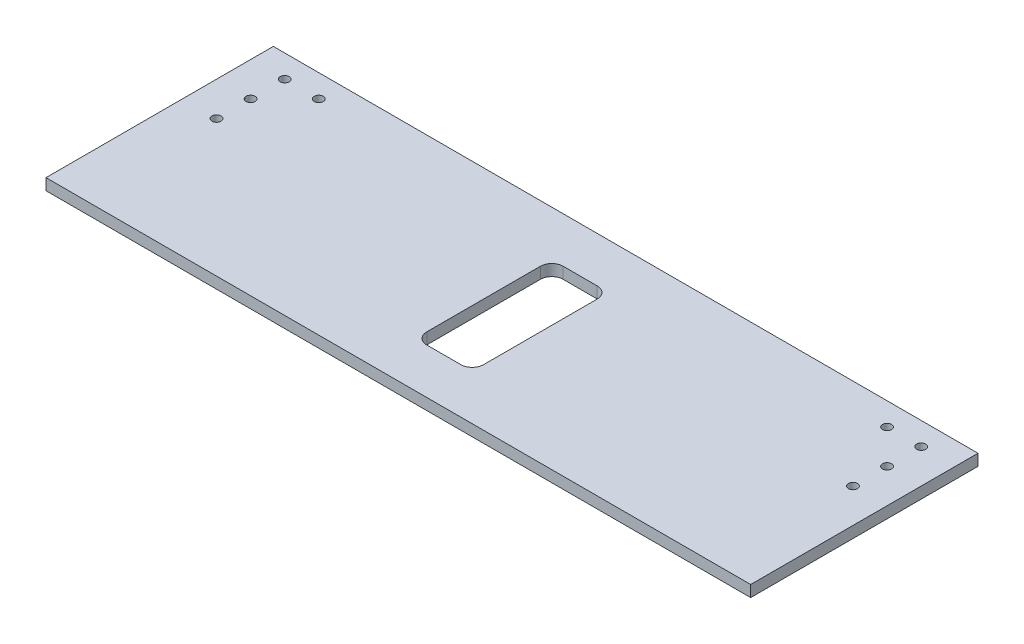
ISO-10303-21;
HEADER;
FILE_DESCRIPTION(('STEP AP214'),'2;1');
FILE_NAME('part.step','',(''),(''),'','','');
FILE_SCHEMA(('AUTOMOTIVE_DESIGN { 1 0 10303 214 1 1 1 1 }'));
ENDSEC;
DATA;
#1=APPLICATION_CONTEXT('core data for automotive mechanical design processes');
#2=APPLICATION_PROTOCOL_DEFINITION('international standard','automotive_design',2000,#1);
#3=PRODUCT_CONTEXT('',#1,'mechanical');
#4=PRODUCT('Part','Part','',(#3));
#5=PRODUCT_RELATED_PRODUCT_CATEGORY('part','',(#4));
#6=PRODUCT_DEFINITION_FORMATION('','',#4);
#7=PRODUCT_DEFINITION_CONTEXT('part definition',#1,'design');
#8=PRODUCT_DEFINITION('design','',#6,#7);
#9=PRODUCT_DEFINITION_SHAPE('','',#8);
#10=(LENGTH_UNIT() NAMED_UNIT(*) SI_UNIT(.MILLI.,.METRE.));
#11=(NAMED_UNIT(*) PLANE_ANGLE_UNIT() SI_UNIT($,.RADIAN.));
#12=(NAMED_UNIT(*) SI_UNIT($,.STERADIAN.) SOLID_ANGLE_UNIT());
#13=UNCERTAINTY_MEASURE_WITH_UNIT(LENGTH_MEASURE(1.E-05),#10,'distance_accuracy_value','');
#14=(GEOMETRIC_REPRESENTATION_CONTEXT(3) GLOBAL_UNCERTAINTY_ASSIGNED_CONTEXT((#13)) GLOBAL_UNIT_ASSIGNED_CONTEXT((#10,
#11,#12)) REPRESENTATION_CONTEXT('',''));
#15=CARTESIAN_POINT('',(0.,0.,0.));
#16=DIRECTION('',(0.,0.,1.));
#17=DIRECTION('',(1.,0.,0.));
#18=AXIS2_PLACEMENT_3D('',#15,#16,#17);
#19=CARTESIAN_POINT('',(-155.,5.,0.));
#20=DIRECTION('',(1.,0.,0.));
#21=DIRECTION('',(0.,0.,-1.));
#22=AXIS2_PLACEMENT_3D('',#19,#20,#21);
#23=PLANE('',#22);
#24=DIRECTION('',(0.,0.,1.));
#25=VECTOR('',#24,1.);
#26=CARTESIAN_POINT('',(-155.,5.,0.));
#27=LINE('',#26,#25);
#28=CARTESIAN_POINT('',(-155.,5.,-50.));
#29=VERTEX_POINT('',#28);
#30=CARTESIAN_POINT('',(-155.,5.,50.));
#31=VERTEX_POINT('',#30);
#32=EDGE_CURVE('E147',#29,#31,#27,.T.);
#33=ORIENTED_EDGE('',*,*,#32,.F.);
#34=DIRECTION('',(0.,1.,0.));
#35=VECTOR('',#34,1.);
#36=CARTESIAN_POINT('',(-155.,0.,-50.));
#37=LINE('',#36,#35);
#38=CARTESIAN_POINT('',(-155.,0.,-50.));
#39=VERTEX_POINT('',#38);
#40=EDGE_CURVE('E133',#39,#29,#37,.T.);
#41=ORIENTED_EDGE('',*,*,#40,.F.);
#42=DIRECTION('',(0.,0.,1.));
#43=VECTOR('',#42,1.);
#44=CARTESIAN_POINT('',(-155.,0.,0.));
#45=LINE('',#44,#43);
#46=CARTESIAN_POINT('',(-155.,0.,50.));
#47=VERTEX_POINT('',#46);
#48=EDGE_CURVE('E145',#39,#47,#45,.T.);
#49=ORIENTED_EDGE('',*,*,#48,.T.);
#50=DIRECTION('',(0.,-1.,0.));
#51=VECTOR('',#50,1.);
#52=CARTESIAN_POINT('',(-155.,5.,50.));
#53=LINE('',#52,#51);
#54=EDGE_CURVE('E168',#31,#47,#53,.T.);
#55=ORIENTED_EDGE('',*,*,#54,.F.);
#56=EDGE_LOOP('',(#33,#41,#49,#55));
#57=FACE_BOUND('',#56,.T.);
#58=ADVANCED_FACE('F40',(#57),#23,.F.);
#59=CARTESIAN_POINT('',(0.,5.,50.));
#60=DIRECTION('',(0.,0.,-1.));
#61=DIRECTION('',(-1.,0.,0.));
#62=AXIS2_PLACEMENT_3D('',#59,#60,#61);
#63=PLANE('',#62);
#64=DIRECTION('',(1.,0.,0.));
#65=VECTOR('',#64,1.);
#66=CARTESIAN_POINT('',(0.,0.,50.));
#67=LINE('',#66,#65);
#68=CARTESIAN_POINT('',(155.,0.,50.));
#69=VERTEX_POINT('',#68);
#70=EDGE_CURVE('E153',#47,#69,#67,.T.);
#71=ORIENTED_EDGE('',*,*,#70,.T.);
#72=DIRECTION('',(0.,-1.,0.));
#73=VECTOR('',#72,1.);
#74=CARTESIAN_POINT('',(155.,5.,50.));
#75=LINE('',#74,#73);
#76=CARTESIAN_POINT('',(155.,5.,50.));
#77=VERTEX_POINT('',#76);
#78=EDGE_CURVE('E165',#77,#69,#75,.T.);
#79=ORIENTED_EDGE('',*,*,#78,.F.);
#80=DIRECTION('',(1.,0.,0.));
#81=VECTOR('',#80,1.);
#82=CARTESIAN_POINT('',(0.,5.,50.));
#83=LINE('',#82,#81);
#84=EDGE_CURVE('E237',#31,#77,#83,.T.);
#85=ORIENTED_EDGE('',*,*,#84,.F.);
#86=ORIENTED_EDGE('',*,*,#54,.T.);
#87=EDGE_LOOP('',(#71,#79,#85,#86));
#88=FACE_BOUND('',#87,.T.);
#89=ADVANCED_FACE('F322',(#88),#63,.F.);
#90=CARTESIAN_POINT('',(155.,5.,0.));
#91=DIRECTION('',(1.,0.,0.));
#92=DIRECTION('',(0.,0.,-1.));
#93=AXIS2_PLACEMENT_3D('',#90,#91,#92);
#94=PLANE('',#93);
#95=DIRECTION('',(0.,1.,0.));
#96=VECTOR('',#95,1.);
#97=CARTESIAN_POINT('',(155.,0.,-50.));
#98=LINE('',#97,#96);
#99=CARTESIAN_POINT('',(155.,0.,-50.));
#100=VERTEX_POINT('',#99);
#101=CARTESIAN_POINT('',(155.,5.,-50.));
#102=VERTEX_POINT('',#101);
#103=EDGE_CURVE('E136',#100,#102,#98,.T.);
#104=ORIENTED_EDGE('',*,*,#103,.T.);
#105=DIRECTION('',(0.,0.,1.));
#106=VECTOR('',#105,1.);
#107=CARTESIAN_POINT('',(155.,5.,0.));
#108=LINE('',#107,#106);
#109=EDGE_CURVE('E161',#102,#77,#108,.T.);
#110=ORIENTED_EDGE('',*,*,#109,.T.);
#111=ORIENTED_EDGE('',*,*,#78,.T.);
#112=DIRECTION('',(0.,0.,1.));
#113=VECTOR('',#112,1.);
#114=CARTESIAN_POINT('',(155.,0.,0.));
#115=LINE('',#114,#113);
#116=EDGE_CURVE('E156',#100,#69,#115,.T.);
#117=ORIENTED_EDGE('',*,*,#116,.F.);
#118=EDGE_LOOP('',(#104,#110,#111,#117));
#119=FACE_BOUND('',#118,.T.);
#120=ADVANCED_FACE('F244',(#119),#94,.T.);
#121=CARTESIAN_POINT('',(0.,5.,0.));
#122=DIRECTION('',(0.,1.,0.));
#123=DIRECTION('',(0.,0.,1.));
#124=AXIS2_PLACEMENT_3D('',#121,#122,#123);
#125=PLANE('',#124);
#126=DIRECTION('',(1.,0.,0.));
#127=VECTOR('',#126,1.);
#128=CARTESIAN_POINT('',(-40.,5.,-50.));
#129=LINE('',#128,#127);
#130=EDGE_CURVE('E141',#29,#102,#129,.T.);
#131=ORIENTED_EDGE('',*,*,#130,.F.);
#132=ORIENTED_EDGE('',*,*,#32,.T.);
#133=ORIENTED_EDGE('',*,*,#84,.T.);
#134=ORIENTED_EDGE('',*,*,#109,.F.);
#135=EDGE_LOOP('',(#131,#132,#133,#134));
#136=FACE_BOUND('',#135,.T.);
#137=CARTESIAN_POINT('',(140.,5.,-40.));
#138=DIRECTION('',(0.,1.,0.));
#139=DIRECTION('',(0.,0.,-1.));
#140=AXIS2_PLACEMENT_3D('',#137,#138,#139);
#141=CIRCLE('',#140,2.);
#142=CARTESIAN_POINT('',(140.,5.,-42.));
#143=VERTEX_POINT('',#142);
#144=EDGE_CURVE('E140',#143,#143,#141,.T.);
#145=ORIENTED_EDGE('',*,*,#144,.F.);
#146=EDGE_LOOP('',(#145));
#147=FACE_BOUND('',#146,.T.);
#148=CARTESIAN_POINT('',(125.,5.,-40.));
#149=DIRECTION('',(0.,1.,0.));
#150=DIRECTION('',(0.,0.,-1.));
#151=AXIS2_PLACEMENT_3D('',#148,#149,#150);
#152=CIRCLE('',#151,2.);
#153=CARTESIAN_POINT('',(125.,5.,-42.));
#154=VERTEX_POINT('',#153);
#155=EDGE_CURVE('E287',#154,#154,#152,.T.);
#156=ORIENTED_EDGE('',*,*,#155,.F.);
#157=EDGE_LOOP('',(#156));
#158=FACE_BOUND('',#157,.T.);
#159=CARTESIAN_POINT('',(140.,5.,-25.));
#160=DIRECTION('',(0.,1.,0.));
#161=DIRECTION('',(0.,0.,-1.));
#162=AXIS2_PLACEMENT_3D('',#159,#160,#161);
#163=CIRCLE('',#162,2.);
#164=CARTESIAN_POINT('',(140.,5.,-27.));
#165=VERTEX_POINT('',#164);
#166=EDGE_CURVE('E281',#165,#165,#163,.T.);
#167=ORIENTED_EDGE('',*,*,#166,.F.);
#168=EDGE_LOOP('',(#167));
#169=FACE_BOUND('',#168,.T.);
#170=CARTESIAN_POINT('',(140.,5.,-10.));
#171=DIRECTION('',(0.,1.,0.));
#172=DIRECTION('',(0.,0.,-1.));
#173=AXIS2_PLACEMENT_3D('',#170,#171,#172);
#174=CIRCLE('',#173,2.);
#175=CARTESIAN_POINT('',(140.,5.,-12.));
#176=VERTEX_POINT('',#175);
#177=EDGE_CURVE('E275',#176,#176,#174,.T.);
#178=ORIENTED_EDGE('',*,*,#177,.F.);
#179=EDGE_LOOP('',(#178));
#180=FACE_BOUND('',#179,.T.);
#181=CARTESIAN_POINT('',(-140.,5.,-10.));
#182=DIRECTION('',(0.,1.,0.));
#183=DIRECTION('',(0.,0.,1.));
#184=AXIS2_PLACEMENT_3D('',#181,#182,#183);
#185=CIRCLE('',#184,2.);
#186=CARTESIAN_POINT('',(-140.,5.,-8.00000000000001));
#187=VERTEX_POINT('',#186);
#188=EDGE_CURVE('E269',#187,#187,#185,.T.);
#189=ORIENTED_EDGE('',*,*,#188,.F.);
#190=EDGE_LOOP('',(#189));
#191=FACE_BOUND('',#190,.T.);
#192=CARTESIAN_POINT('',(-140.,5.,-25.));
#193=DIRECTION('',(0.,1.,0.));
#194=DIRECTION('',(0.,0.,1.));
#195=AXIS2_PLACEMENT_3D('',#192,#193,#194);
#196=CIRCLE('',#195,2.);
#197=CARTESIAN_POINT('',(-140.,5.,-23.));
#198=VERTEX_POINT('',#197);
#199=EDGE_CURVE('E263',#198,#198,#196,.T.);
#200=ORIENTED_EDGE('',*,*,#199,.F.);
#201=EDGE_LOOP('',(#200));
#202=FACE_BOUND('',#201,.T.);
#203=CARTESIAN_POINT('',(-125.,5.,-40.));
#204=DIRECTION('',(0.,1.,0.));
#205=DIRECTION('',(0.,0.,1.));
#206=AXIS2_PLACEMENT_3D('',#203,#204,#205);
#207=CIRCLE('',#206,2.);
#208=CARTESIAN_POINT('',(-125.,5.,-38.));
#209=VERTEX_POINT('',#208);
#210=EDGE_CURVE('E257',#209,#209,#207,.T.);
#211=ORIENTED_EDGE('',*,*,#210,.F.);
#212=EDGE_LOOP('',(#211));
#213=FACE_BOUND('',#212,.T.);
#214=CARTESIAN_POINT('',(-140.,5.,-40.));
#215=DIRECTION('',(0.,1.,0.));
#216=DIRECTION('',(0.,0.,1.));
#217=AXIS2_PLACEMENT_3D('',#214,#215,#216);
#218=CIRCLE('',#217,2.);
#219=CARTESIAN_POINT('',(-140.,5.,-38.));
#220=VERTEX_POINT('',#219);
#221=EDGE_CURVE('E251',#220,#220,#218,.T.);
#222=ORIENTED_EDGE('',*,*,#221,.F.);
#223=EDGE_LOOP('',(#222));
#224=FACE_BOUND('',#223,.T.);
#225=DIRECTION('',(0.,0.,-1.));
#226=VECTOR('',#225,1.);
#227=CARTESIAN_POINT('',(12.5,5.,30.));
#228=LINE('',#227,#226);
#229=CARTESIAN_POINT('',(12.5,5.,25.));
#230=VERTEX_POINT('',#229);
#231=CARTESIAN_POINT('',(12.5,5.,-25.));
#232=VERTEX_POINT('',#231);
#233=EDGE_CURVE('E216',#230,#232,#228,.T.);
#234=ORIENTED_EDGE('',*,*,#233,.F.);
#235=CARTESIAN_POINT('',(7.5,5.,25.));
#236=DIRECTION('',(0.,1.,0.));
#237=DIRECTION('',(0.,0.,1.));
#238=AXIS2_PLACEMENT_3D('',#235,#236,#237);
#239=CIRCLE('',#238,5.);
#240=CARTESIAN_POINT('',(7.5,5.,30.));
#241=VERTEX_POINT('',#240);
#242=EDGE_CURVE('E197',#230,#241,#239,.F.);
#243=ORIENTED_EDGE('',*,*,#242,.T.);
#244=DIRECTION('',(1.,0.,0.));
#245=VECTOR('',#244,1.);
#246=CARTESIAN_POINT('',(-12.5,5.,30.));
#247=LINE('',#246,#245);
#248=CARTESIAN_POINT('',(-7.5,5.,30.));
#249=VERTEX_POINT('',#248);
#250=EDGE_CURVE('E234',#249,#241,#247,.T.);
#251=ORIENTED_EDGE('',*,*,#250,.F.);
#252=CARTESIAN_POINT('',(-7.5,5.,25.));
#253=DIRECTION('',(0.,1.,0.));
#254=DIRECTION('',(0.,0.,1.));
#255=AXIS2_PLACEMENT_3D('',#252,#253,#254);
#256=CIRCLE('',#255,5.);
#257=CARTESIAN_POINT('',(-12.5,5.,25.));
#258=VERTEX_POINT('',#257);
#259=EDGE_CURVE('E189',#249,#258,#256,.F.);
#260=ORIENTED_EDGE('',*,*,#259,.T.);
#261=DIRECTION('',(0.,0.,1.));
#262=VECTOR('',#261,1.);
#263=CARTESIAN_POINT('',(-12.5,5.,30.));
#264=LINE('',#263,#262);
#265=CARTESIAN_POINT('',(-12.5,5.,-25.));
#266=VERTEX_POINT('',#265);
#267=EDGE_CURVE('E207',#266,#258,#264,.T.);
#268=ORIENTED_EDGE('',*,*,#267,.F.);
#269=CARTESIAN_POINT('',(-7.5,5.,-25.));
#270=DIRECTION('',(0.,1.,0.));
#271=DIRECTION('',(0.,0.,1.));
#272=AXIS2_PLACEMENT_3D('',#269,#270,#271);
#273=CIRCLE('',#272,5.);
#274=CARTESIAN_POINT('',(-7.5,5.,-30.));
#275=VERTEX_POINT('',#274);
#276=EDGE_CURVE('E48',#266,#275,#273,.F.);
#277=ORIENTED_EDGE('',*,*,#276,.T.);
#278=DIRECTION('',(-1.,0.,0.));
#279=VECTOR('',#278,1.);
#280=CARTESIAN_POINT('',(-12.5,5.,-30.));
#281=LINE('',#280,#279);
#282=CARTESIAN_POINT('',(7.5,5.,-30.));
#283=VERTEX_POINT('',#282);
#284=EDGE_CURVE('E205',#283,#275,#281,.T.);
#285=ORIENTED_EDGE('',*,*,#284,.F.);
#286=CARTESIAN_POINT('',(7.5,5.,-25.));
#287=DIRECTION('',(0.,1.,0.));
#288=DIRECTION('',(0.,0.,1.));
#289=AXIS2_PLACEMENT_3D('',#286,#287,#288);
#290=CIRCLE('',#289,5.);
#291=EDGE_CURVE('E193',#283,#232,#290,.F.);
#292=ORIENTED_EDGE('',*,*,#291,.T.);
#293=EDGE_LOOP('',(#234,#243,#251,#260,#268,#277,#285,#292));
#294=FACE_BOUND('',#293,.T.);
#295=ADVANCED_FACE('F204',(#136,#147,#158,#169,#180,#191,#202,#213,#224,#294),#125,.T.);
#296=CARTESIAN_POINT('',(0.,0.,0.));
#297=DIRECTION('',(0.,1.,0.));
#298=DIRECTION('',(0.,0.,1.));
#299=AXIS2_PLACEMENT_3D('',#296,#297,#298);
#300=PLANE('',#299);
#301=ORIENTED_EDGE('',*,*,#48,.F.);
#302=DIRECTION('',(1.,0.,0.));
#303=VECTOR('',#302,1.);
#304=CARTESIAN_POINT('',(-40.,0.,-50.));
#305=LINE('',#304,#303);
#306=EDGE_CURVE('E130',#39,#100,#305,.T.);
#307=ORIENTED_EDGE('',*,*,#306,.T.);
#308=ORIENTED_EDGE('',*,*,#116,.T.);
#309=ORIENTED_EDGE('',*,*,#70,.F.);
#310=EDGE_LOOP('',(#301,#307,#308,#309));
#311=FACE_BOUND('',#310,.T.);
#312=CARTESIAN_POINT('',(140.,0.,-40.));
#313=DIRECTION('',(0.,1.,0.));
#314=DIRECTION('',(0.,0.,-1.));
#315=AXIS2_PLACEMENT_3D('',#312,#313,#314);
#316=CIRCLE('',#315,2.);
#317=CARTESIAN_POINT('',(140.,0.,-42.));
#318=VERTEX_POINT('',#317);
#319=EDGE_CURVE('E290',#318,#318,#316,.T.);
#320=ORIENTED_EDGE('',*,*,#319,.T.);
#321=EDGE_LOOP('',(#320));
#322=FACE_BOUND('',#321,.T.);
#323=CARTESIAN_POINT('',(125.,0.,-40.));
#324=DIRECTION('',(0.,1.,0.));
#325=DIRECTION('',(0.,0.,-1.));
#326=AXIS2_PLACEMENT_3D('',#323,#324,#325);
#327=CIRCLE('',#326,2.);
#328=CARTESIAN_POINT('',(125.,0.,-42.));
#329=VERTEX_POINT('',#328);
#330=EDGE_CURVE('E284',#329,#329,#327,.T.);
#331=ORIENTED_EDGE('',*,*,#330,.T.);
#332=EDGE_LOOP('',(#331));
#333=FACE_BOUND('',#332,.T.);
#334=CARTESIAN_POINT('',(140.,0.,-25.));
#335=DIRECTION('',(0.,1.,0.));
#336=DIRECTION('',(0.,0.,-1.));
#337=AXIS2_PLACEMENT_3D('',#334,#335,#336);
#338=CIRCLE('',#337,2.);
#339=CARTESIAN_POINT('',(140.,0.,-27.));
#340=VERTEX_POINT('',#339);
#341=EDGE_CURVE('E278',#340,#340,#338,.T.);
#342=ORIENTED_EDGE('',*,*,#341,.T.);
#343=EDGE_LOOP('',(#342));
#344=FACE_BOUND('',#343,.T.);
#345=CARTESIAN_POINT('',(140.,0.,-10.));
#346=DIRECTION('',(0.,1.,0.));
#347=DIRECTION('',(0.,0.,-1.));
#348=AXIS2_PLACEMENT_3D('',#345,#346,#347);
#349=CIRCLE('',#348,2.);
#350=CARTESIAN_POINT('',(140.,0.,-12.));
#351=VERTEX_POINT('',#350);
#352=EDGE_CURVE('E272',#351,#351,#349,.T.);
#353=ORIENTED_EDGE('',*,*,#352,.T.);
#354=EDGE_LOOP('',(#353));
#355=FACE_BOUND('',#354,.T.);
#356=CARTESIAN_POINT('',(-140.,0.,-10.));
#357=DIRECTION('',(0.,1.,0.));
#358=DIRECTION('',(0.,0.,1.));
#359=AXIS2_PLACEMENT_3D('',#356,#357,#358);
#360=CIRCLE('',#359,2.);
#361=CARTESIAN_POINT('',(-140.,0.,-8.00000000000001));
#362=VERTEX_POINT('',#361);
#363=EDGE_CURVE('E266',#362,#362,#360,.T.);
#364=ORIENTED_EDGE('',*,*,#363,.T.);
#365=EDGE_LOOP('',(#364));
#366=FACE_BOUND('',#365,.T.);
#367=CARTESIAN_POINT('',(-140.,0.,-25.));
#368=DIRECTION('',(0.,1.,0.));
#369=DIRECTION('',(0.,0.,1.));
#370=AXIS2_PLACEMENT_3D('',#367,#368,#369);
#371=CIRCLE('',#370,2.);
#372=CARTESIAN_POINT('',(-140.,0.,-23.));
#373=VERTEX_POINT('',#372);
#374=EDGE_CURVE('E260',#373,#373,#371,.T.);
#375=ORIENTED_EDGE('',*,*,#374,.T.);
#376=EDGE_LOOP('',(#375));
#377=FACE_BOUND('',#376,.T.);
#378=CARTESIAN_POINT('',(-125.,0.,-40.));
#379=DIRECTION('',(0.,1.,0.));
#380=DIRECTION('',(0.,0.,1.));
#381=AXIS2_PLACEMENT_3D('',#378,#379,#380);
#382=CIRCLE('',#381,2.);
#383=CARTESIAN_POINT('',(-125.,0.,-38.));
#384=VERTEX_POINT('',#383);
#385=EDGE_CURVE('E254',#384,#384,#382,.T.);
#386=ORIENTED_EDGE('',*,*,#385,.T.);
#387=EDGE_LOOP('',(#386));
#388=FACE_BOUND('',#387,.T.);
#389=CARTESIAN_POINT('',(-140.,0.,-40.));
#390=DIRECTION('',(0.,1.,0.));
#391=DIRECTION('',(0.,0.,1.));
#392=AXIS2_PLACEMENT_3D('',#389,#390,#391);
#393=CIRCLE('',#392,2.);
#394=CARTESIAN_POINT('',(-140.,0.,-38.));
#395=VERTEX_POINT('',#394);
#396=EDGE_CURVE('E231',#395,#395,#393,.T.);
#397=ORIENTED_EDGE('',*,*,#396,.T.);
#398=EDGE_LOOP('',(#397));
#399=FACE_BOUND('',#398,.T.);
#400=DIRECTION('',(0.,0.,1.));
#401=VECTOR('',#400,1.);
#402=CARTESIAN_POINT('',(-12.5,0.,30.));
#403=LINE('',#402,#401);
#404=CARTESIAN_POINT('',(-12.5,0.,-25.));
#405=VERTEX_POINT('',#404);
#406=CARTESIAN_POINT('',(-12.5,0.,25.));
#407=VERTEX_POINT('',#406);
#408=EDGE_CURVE('E158',#405,#407,#403,.T.);
#409=ORIENTED_EDGE('',*,*,#408,.T.);
#410=CARTESIAN_POINT('',(-7.5,0.,25.));
#411=DIRECTION('',(0.,1.,0.));
#412=DIRECTION('',(0.,0.,1.));
#413=AXIS2_PLACEMENT_3D('',#410,#411,#412);
#414=CIRCLE('',#413,5.);
#415=CARTESIAN_POINT('',(-7.5,0.,30.));
#416=VERTEX_POINT('',#415);
#417=EDGE_CURVE('E191',#407,#416,#414,.T.);
#418=ORIENTED_EDGE('',*,*,#417,.T.);
#419=DIRECTION('',(1.,0.,0.));
#420=VECTOR('',#419,1.);
#421=CARTESIAN_POINT('',(-12.5,0.,30.));
#422=LINE('',#421,#420);
#423=CARTESIAN_POINT('',(7.5,0.,30.));
#424=VERTEX_POINT('',#423);
#425=EDGE_CURVE('E154',#416,#424,#422,.T.);
#426=ORIENTED_EDGE('',*,*,#425,.T.);
#427=CARTESIAN_POINT('',(7.5,0.,25.));
#428=DIRECTION('',(0.,1.,0.));
#429=DIRECTION('',(0.,0.,1.));
#430=AXIS2_PLACEMENT_3D('',#427,#428,#429);
#431=CIRCLE('',#430,5.);
#432=CARTESIAN_POINT('',(12.5,0.,25.));
#433=VERTEX_POINT('',#432);
#434=EDGE_CURVE('E62',#424,#433,#431,.T.);
#435=ORIENTED_EDGE('',*,*,#434,.T.);
#436=DIRECTION('',(0.,0.,-1.));
#437=VECTOR('',#436,1.);
#438=CARTESIAN_POINT('',(12.5,0.,30.));
#439=LINE('',#438,#437);
#440=CARTESIAN_POINT('',(12.5,0.,-25.));
#441=VERTEX_POINT('',#440);
#442=EDGE_CURVE('E227',#433,#441,#439,.T.);
#443=ORIENTED_EDGE('',*,*,#442,.T.);
#444=CARTESIAN_POINT('',(7.5,0.,-25.));
#445=DIRECTION('',(0.,1.,0.));
#446=DIRECTION('',(0.,0.,1.));
#447=AXIS2_PLACEMENT_3D('',#444,#445,#446);
#448=CIRCLE('',#447,5.);
#449=CARTESIAN_POINT('',(7.5,0.,-30.));
#450=VERTEX_POINT('',#449);
#451=EDGE_CURVE('E195',#441,#450,#448,.T.);
#452=ORIENTED_EDGE('',*,*,#451,.T.);
#453=DIRECTION('',(-1.,0.,0.));
#454=VECTOR('',#453,1.);
#455=CARTESIAN_POINT('',(-12.5,0.,-30.));
#456=LINE('',#455,#454);
#457=CARTESIAN_POINT('',(-7.5,0.,-30.));
#458=VERTEX_POINT('',#457);
#459=EDGE_CURVE('E222',#450,#458,#456,.T.);
#460=ORIENTED_EDGE('',*,*,#459,.T.);
#461=CARTESIAN_POINT('',(-7.5,0.,-25.));
#462=DIRECTION('',(0.,1.,0.));
#463=DIRECTION('',(0.,0.,1.));
#464=AXIS2_PLACEMENT_3D('',#461,#462,#463);
#465=CIRCLE('',#464,5.);
#466=EDGE_CURVE('E11',#458,#405,#465,.T.);
#467=ORIENTED_EDGE('',*,*,#466,.T.);
#468=EDGE_LOOP('',(#409,#418,#426,#435,#443,#452,#460,#467));
#469=FACE_BOUND('',#468,.T.);
#470=ADVANCED_FACE('F150',(#311,#322,#333,#344,#355,#366,#377,#388,#399,#469),#300,.F.);
#471=CARTESIAN_POINT('',(12.5,0.,30.));
#472=DIRECTION('',(1.,0.,0.));
#473=DIRECTION('',(0.,0.,-1.));
#474=AXIS2_PLACEMENT_3D('',#471,#472,#473);
#475=PLANE('',#474);
#476=ORIENTED_EDGE('',*,*,#233,.T.);
#477=DIRECTION('',(0.,1.,0.));
#478=VECTOR('',#477,1.);
#479=CARTESIAN_POINT('',(12.5,0.,-25.));
#480=LINE('',#479,#478);
#481=EDGE_CURVE('E55',#232,#441,#480,.F.);
#482=ORIENTED_EDGE('',*,*,#481,.T.);
#483=ORIENTED_EDGE('',*,*,#442,.F.);
#484=DIRECTION('',(0.,1.,0.));
#485=VECTOR('',#484,1.);
#486=CARTESIAN_POINT('',(12.5,5.,25.));
#487=LINE('',#486,#485);
#488=EDGE_CURVE('E185',#433,#230,#487,.T.);
#489=ORIENTED_EDGE('',*,*,#488,.T.);
#490=EDGE_LOOP('',(#476,#482,#483,#489));
#491=FACE_BOUND('',#490,.T.);
#492=ADVANCED_FACE('F298',(#491),#475,.F.);
#493=CARTESIAN_POINT('',(-12.5,0.,30.));
#494=DIRECTION('',(0.,0.,1.));
#495=DIRECTION('',(1.,0.,0.));
#496=AXIS2_PLACEMENT_3D('',#493,#494,#495);
#497=PLANE('',#496);
#498=ORIENTED_EDGE('',*,*,#425,.F.);
#499=DIRECTION('',(0.,1.,0.));
#500=VECTOR('',#499,1.);
#501=CARTESIAN_POINT('',(-7.5,5.,30.));
#502=LINE('',#501,#500);
#503=EDGE_CURVE('E172',#416,#249,#502,.T.);
#504=ORIENTED_EDGE('',*,*,#503,.T.);
#505=ORIENTED_EDGE('',*,*,#250,.T.);
#506=DIRECTION('',(0.,1.,0.));
#507=VECTOR('',#506,1.);
#508=CARTESIAN_POINT('',(7.5,0.,30.));
#509=LINE('',#508,#507);
#510=EDGE_CURVE('E170',#241,#424,#509,.F.);
#511=ORIENTED_EDGE('',*,*,#510,.T.);
#512=EDGE_LOOP('',(#498,#504,#505,#511));
#513=FACE_BOUND('',#512,.T.);
#514=ADVANCED_FACE('F305',(#513),#497,.F.);
#515=CARTESIAN_POINT('',(-12.5,0.,30.));
#516=DIRECTION('',(-1.,0.,0.));
#517=DIRECTION('',(0.,0.,1.));
#518=AXIS2_PLACEMENT_3D('',#515,#516,#517);
#519=PLANE('',#518);
#520=ORIENTED_EDGE('',*,*,#267,.T.);
#521=DIRECTION('',(0.,1.,0.));
#522=VECTOR('',#521,1.);
#523=CARTESIAN_POINT('',(-12.5,0.,25.));
#524=LINE('',#523,#522);
#525=EDGE_CURVE('E178',#258,#407,#524,.F.);
#526=ORIENTED_EDGE('',*,*,#525,.T.);
#527=ORIENTED_EDGE('',*,*,#408,.F.);
#528=DIRECTION('',(0.,1.,0.));
#529=VECTOR('',#528,1.);
#530=CARTESIAN_POINT('',(-12.5,5.,-25.));
#531=LINE('',#530,#529);
#532=EDGE_CURVE('E175',#405,#266,#531,.T.);
#533=ORIENTED_EDGE('',*,*,#532,.T.);
#534=EDGE_LOOP('',(#520,#526,#527,#533));
#535=FACE_BOUND('',#534,.T.);
#536=ADVANCED_FACE('F224',(#535),#519,.F.);
#537=CARTESIAN_POINT('',(-12.5,0.,-30.));
#538=DIRECTION('',(0.,0.,-1.));
#539=DIRECTION('',(-1.,0.,0.));
#540=AXIS2_PLACEMENT_3D('',#537,#538,#539);
#541=PLANE('',#540);
#542=ORIENTED_EDGE('',*,*,#459,.F.);
#543=DIRECTION('',(0.,1.,0.));
#544=VECTOR('',#543,1.);
#545=CARTESIAN_POINT('',(7.5,5.,-30.));
#546=LINE('',#545,#544);
#547=EDGE_CURVE('E182',#450,#283,#546,.T.);
#548=ORIENTED_EDGE('',*,*,#547,.T.);
#549=ORIENTED_EDGE('',*,*,#284,.T.);
#550=DIRECTION('',(0.,1.,0.));
#551=VECTOR('',#550,1.);
#552=CARTESIAN_POINT('',(-7.5,0.,-30.));
#553=LINE('',#552,#551);
#554=EDGE_CURVE('E180',#275,#458,#553,.F.);
#555=ORIENTED_EDGE('',*,*,#554,.T.);
#556=EDGE_LOOP('',(#542,#548,#549,#555));
#557=FACE_BOUND('',#556,.T.);
#558=ADVANCED_FACE('F213',(#557),#541,.F.);
#559=CARTESIAN_POINT('',(-140.,0.,-40.));
#560=DIRECTION('',(0.,1.,0.));
#561=DIRECTION('',(0.,0.,1.));
#562=AXIS2_PLACEMENT_3D('',#559,#560,#561);
#563=CYLINDRICAL_SURFACE('',#562,2.);
#564=ORIENTED_EDGE('',*,*,#396,.F.);
#565=EDGE_LOOP('',(#564));
#566=FACE_BOUND('',#565,.T.);
#567=ORIENTED_EDGE('',*,*,#221,.T.);
#568=EDGE_LOOP('',(#567));
#569=FACE_BOUND('',#568,.T.);
#570=ADVANCED_FACE('F339',(#566,#569),#563,.F.);
#571=CARTESIAN_POINT('',(-125.,0.,-40.));
#572=DIRECTION('',(0.,1.,0.));
#573=DIRECTION('',(0.,0.,1.));
#574=AXIS2_PLACEMENT_3D('',#571,#572,#573);
#575=CYLINDRICAL_SURFACE('',#574,2.);
#576=ORIENTED_EDGE('',*,*,#385,.F.);
#577=EDGE_LOOP('',(#576));
#578=FACE_BOUND('',#577,.T.);
#579=ORIENTED_EDGE('',*,*,#210,.T.);
#580=EDGE_LOOP('',(#579));
#581=FACE_BOUND('',#580,.T.);
#582=ADVANCED_FACE('F362',(#578,#581),#575,.F.);
#583=CARTESIAN_POINT('',(-140.,0.,-25.));
#584=DIRECTION('',(0.,1.,0.));
#585=DIRECTION('',(0.,0.,1.));
#586=AXIS2_PLACEMENT_3D('',#583,#584,#585);
#587=CYLINDRICAL_SURFACE('',#586,2.);
#588=ORIENTED_EDGE('',*,*,#374,.F.);
#589=EDGE_LOOP('',(#588));
#590=FACE_BOUND('',#589,.T.);
#591=ORIENTED_EDGE('',*,*,#199,.T.);
#592=EDGE_LOOP('',(#591));
#593=FACE_BOUND('',#592,.T.);
#594=ADVANCED_FACE('F358',(#590,#593),#587,.F.);
#595=CARTESIAN_POINT('',(-140.,0.,-10.));
#596=DIRECTION('',(0.,1.,0.));
#597=DIRECTION('',(0.,0.,1.));
#598=AXIS2_PLACEMENT_3D('',#595,#596,#597);
#599=CYLINDRICAL_SURFACE('',#598,2.);
#600=ORIENTED_EDGE('',*,*,#363,.F.);
#601=EDGE_LOOP('',(#600));
#602=FACE_BOUND('',#601,.T.);
#603=ORIENTED_EDGE('',*,*,#188,.T.);
#604=EDGE_LOOP('',(#603));
#605=FACE_BOUND('',#604,.T.);
#606=ADVANCED_FACE('F354',(#602,#605),#599,.F.);
#607=CARTESIAN_POINT('',(140.,0.,-10.));
#608=DIRECTION('',(0.,1.,0.));
#609=DIRECTION('',(0.,0.,1.));
#610=AXIS2_PLACEMENT_3D('',#607,#608,#609);
#611=CYLINDRICAL_SURFACE('',#610,2.);
#612=ORIENTED_EDGE('',*,*,#352,.F.);
#613=EDGE_LOOP('',(#612));
#614=FACE_BOUND('',#613,.T.);
#615=ORIENTED_EDGE('',*,*,#177,.T.);
#616=EDGE_LOOP('',(#615));
#617=FACE_BOUND('',#616,.T.);
#618=ADVANCED_FACE('F350',(#614,#617),#611,.F.);
#619=CARTESIAN_POINT('',(140.,0.,-25.));
#620=DIRECTION('',(0.,1.,0.));
#621=DIRECTION('',(0.,0.,1.));
#622=AXIS2_PLACEMENT_3D('',#619,#620,#621);
#623=CYLINDRICAL_SURFACE('',#622,2.);
#624=ORIENTED_EDGE('',*,*,#341,.F.);
#625=EDGE_LOOP('',(#624));
#626=FACE_BOUND('',#625,.T.);
#627=ORIENTED_EDGE('',*,*,#166,.T.);
#628=EDGE_LOOP('',(#627));
#629=FACE_BOUND('',#628,.T.);
#630=ADVANCED_FACE('F346',(#626,#629),#623,.F.);
#631=CARTESIAN_POINT('',(125.,0.,-40.));
#632=DIRECTION('',(0.,1.,0.));
#633=DIRECTION('',(0.,0.,1.));
#634=AXIS2_PLACEMENT_3D('',#631,#632,#633);
#635=CYLINDRICAL_SURFACE('',#634,2.);
#636=ORIENTED_EDGE('',*,*,#330,.F.);
#637=EDGE_LOOP('',(#636));
#638=FACE_BOUND('',#637,.T.);
#639=ORIENTED_EDGE('',*,*,#155,.T.);
#640=EDGE_LOOP('',(#639));
#641=FACE_BOUND('',#640,.T.);
#642=ADVANCED_FACE('F317',(#638,#641),#635,.F.);
#643=CARTESIAN_POINT('',(140.,0.,-40.));
#644=DIRECTION('',(0.,1.,0.));
#645=DIRECTION('',(0.,0.,1.));
#646=AXIS2_PLACEMENT_3D('',#643,#644,#645);
#647=CYLINDRICAL_SURFACE('',#646,2.);
#648=ORIENTED_EDGE('',*,*,#319,.F.);
#649=EDGE_LOOP('',(#648));
#650=FACE_BOUND('',#649,.T.);
#651=ORIENTED_EDGE('',*,*,#144,.T.);
#652=EDGE_LOOP('',(#651));
#653=FACE_BOUND('',#652,.T.);
#654=ADVANCED_FACE('F310',(#650,#653),#647,.F.);
#655=CARTESIAN_POINT('',(-7.5,0.,25.));
#656=DIRECTION('',(0.,-1.,0.));
#657=DIRECTION('',(0.,0.,-1.));
#658=AXIS2_PLACEMENT_3D('',#655,#656,#657);
#659=CYLINDRICAL_SURFACE('',#658,5.);
#660=ORIENTED_EDGE('',*,*,#417,.F.);
#661=ORIENTED_EDGE('',*,*,#525,.F.);
#662=ORIENTED_EDGE('',*,*,#259,.F.);
#663=ORIENTED_EDGE('',*,*,#503,.F.);
#664=EDGE_LOOP('',(#660,#661,#662,#663));
#665=FACE_BOUND('',#664,.T.);
#666=ADVANCED_FACE('F308',(#665),#659,.F.);
#667=CARTESIAN_POINT('',(7.5,0.,-25.));
#668=DIRECTION('',(0.,-1.,0.));
#669=DIRECTION('',(0.,0.,-1.));
#670=AXIS2_PLACEMENT_3D('',#667,#668,#669);
#671=CYLINDRICAL_SURFACE('',#670,5.);
#672=ORIENTED_EDGE('',*,*,#451,.F.);
#673=ORIENTED_EDGE('',*,*,#481,.F.);
#674=ORIENTED_EDGE('',*,*,#291,.F.);
#675=ORIENTED_EDGE('',*,*,#547,.F.);
#676=EDGE_LOOP('',(#672,#673,#674,#675));
#677=FACE_BOUND('',#676,.T.);
#678=ADVANCED_FACE('F297',(#677),#671,.F.);
#679=CARTESIAN_POINT('',(7.5,0.,25.));
#680=DIRECTION('',(0.,-1.,0.));
#681=DIRECTION('',(0.,0.,-1.));
#682=AXIS2_PLACEMENT_3D('',#679,#680,#681);
#683=CYLINDRICAL_SURFACE('',#682,5.);
#684=ORIENTED_EDGE('',*,*,#434,.F.);
#685=ORIENTED_EDGE('',*,*,#510,.F.);
#686=ORIENTED_EDGE('',*,*,#242,.F.);
#687=ORIENTED_EDGE('',*,*,#488,.F.);
#688=EDGE_LOOP('',(#684,#685,#686,#687));
#689=FACE_BOUND('',#688,.T.);
#690=ADVANCED_FACE('F300',(#689),#683,.F.);
#691=CARTESIAN_POINT('',(-7.5,0.,-25.));
#692=DIRECTION('',(0.,-1.,0.));
#693=DIRECTION('',(0.,0.,-1.));
#694=AXIS2_PLACEMENT_3D('',#691,#692,#693);
#695=CYLINDRICAL_SURFACE('',#694,5.);
#696=ORIENTED_EDGE('',*,*,#466,.F.);
#697=ORIENTED_EDGE('',*,*,#554,.F.);
#698=ORIENTED_EDGE('',*,*,#276,.F.);
#699=ORIENTED_EDGE('',*,*,#532,.F.);
#700=EDGE_LOOP('',(#696,#697,#698,#699));
#701=FACE_BOUND('',#700,.T.);
#702=ADVANCED_FACE('F42',(#701),#695,.F.);
#703=CARTESIAN_POINT('',(-40.,0.,-50.));
#704=DIRECTION('',(0.,0.,1.));
#705=DIRECTION('',(1.,0.,0.));
#706=AXIS2_PLACEMENT_3D('',#703,#704,#705);
#707=PLANE('',#706);
#708=ORIENTED_EDGE('',*,*,#306,.F.);
#709=ORIENTED_EDGE('',*,*,#40,.T.);
#710=ORIENTED_EDGE('',*,*,#130,.T.);
#711=ORIENTED_EDGE('',*,*,#103,.F.);
#712=EDGE_LOOP('',(#708,#709,#710,#711));
#713=FACE_BOUND('',#712,.T.);
#714=ADVANCED_FACE('F132',(#713),#707,.F.);
#715=CLOSED_SHELL('',(#58,#89,#120,#295,#470,#492,#514,#536,#558,#570,#582,#594,#606,#618,#630,
#642,#654,#666,#678,#690,#702,#714));
#716=MANIFOLD_SOLID_BREP('B2',#715);
#717=ADVANCED_BREP_SHAPE_REPRESENTATION('',(#18,#716),#14);
#718=SHAPE_DEFINITION_REPRESENTATION(#9,#717);
ENDSEC;
END-ISO-10303-21;
